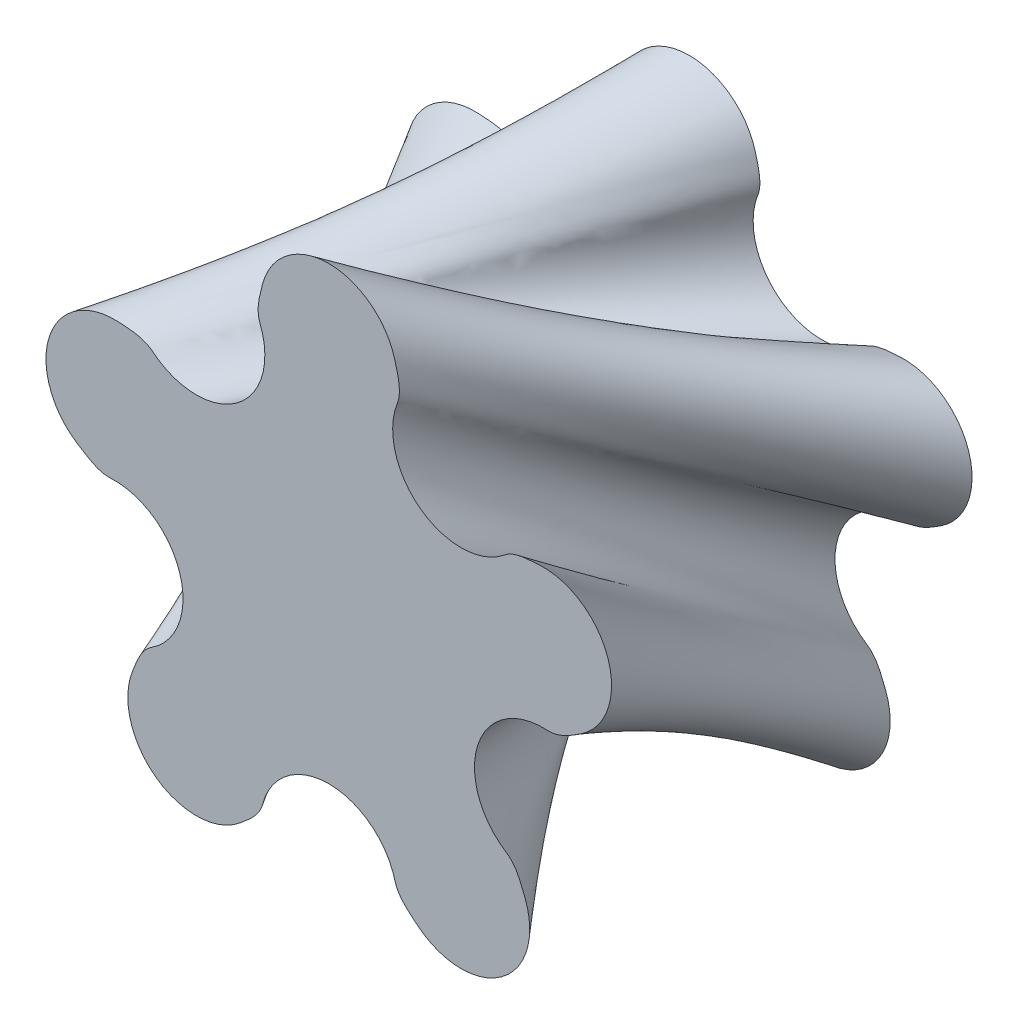
ISO-10303-21;
HEADER;
FILE_DESCRIPTION(('STEP AP214'),'2;1');
FILE_NAME('part.step','',(''),(''),'','','');
FILE_SCHEMA(('AUTOMOTIVE_DESIGN { 1 0 10303 214 1 1 1 1 }'));
ENDSEC;
DATA;
#1=APPLICATION_CONTEXT('core data for automotive mechanical design processes');
#2=APPLICATION_PROTOCOL_DEFINITION('international standard','automotive_design',2000,#1);
#3=PRODUCT_CONTEXT('',#1,'mechanical');
#4=PRODUCT('Part','Part','',(#3));
#5=PRODUCT_RELATED_PRODUCT_CATEGORY('part','',(#4));
#6=PRODUCT_DEFINITION_FORMATION('','',#4);
#7=PRODUCT_DEFINITION_CONTEXT('part definition',#1,'design');
#8=PRODUCT_DEFINITION('design','',#6,#7);
#9=PRODUCT_DEFINITION_SHAPE('','',#8);
#10=(LENGTH_UNIT() NAMED_UNIT(*) SI_UNIT(.MILLI.,.METRE.));
#11=(NAMED_UNIT(*) PLANE_ANGLE_UNIT() SI_UNIT($,.RADIAN.));
#12=(NAMED_UNIT(*) SI_UNIT($,.STERADIAN.) SOLID_ANGLE_UNIT());
#13=UNCERTAINTY_MEASURE_WITH_UNIT(LENGTH_MEASURE(1.E-05),#10,'distance_accuracy_value','');
#14=(GEOMETRIC_REPRESENTATION_CONTEXT(3) GLOBAL_UNCERTAINTY_ASSIGNED_CONTEXT((#13)) GLOBAL_UNIT_ASSIGNED_CONTEXT((#10,
#11,#12)) REPRESENTATION_CONTEXT('',''));
#15=CARTESIAN_POINT('',(0.,0.,0.));
#16=DIRECTION('',(0.,0.,1.));
#17=DIRECTION('',(1.,0.,0.));
#18=AXIS2_PLACEMENT_3D('',#15,#16,#17);
#19=CARTESIAN_POINT('',(-7.83797283048347,0.0889698798174569,12.));
#20=DIRECTION('',(0.,0.,1.));
#21=DIRECTION('',(1.,0.,0.));
#22=AXIS2_PLACEMENT_3D('',#19,#20,#21);
#23=PLANE('',#22);
#24=CARTESIAN_POINT('',(-8.35850427885276,0.393851569912887,12.));
#25=CARTESIAN_POINT('',(-8.02955719358575,0.18428916450994,12.));
#26=CARTESIAN_POINT('',(-7.66147706445491,-0.0646926807636443,12.));
#27=CARTESIAN_POINT('',(-7.27217559089301,-0.0408819826121198,12.));
#28=B_SPLINE_CURVE_WITH_KNOTS('',3,(#24,#25,#26,#27),.UNSPECIFIED.,.F.,.F.,(4,4),(0.,
1.17008686855949),.UNSPECIFIED.);
#29=CARTESIAN_POINT('',(-8.35850427885276,0.393851569912887,12.));
#30=VERTEX_POINT('',#29);
#31=CARTESIAN_POINT('',(-7.27217559085693,-0.0408819826099125,12.));
#32=VERTEX_POINT('',#31);
#33=EDGE_CURVE('E672',#30,#32,#28,.T.);
#34=ORIENTED_EDGE('',*,*,#33,.T.);
#35=CARTESIAN_POINT('',(-7.13292387221381,-2.31762745781239,12.));
#36=DIRECTION('',(0.,0.,-1.));
#37=DIRECTION('',(1.,0.,0.));
#38=AXIS2_PLACEMENT_3D('',#35,#36,#37);
#39=CIRCLE('',#38,2.281);
#40=CARTESIAN_POINT('',(-5.90734346549321,-4.24140334565966,12.));
#41=VERTEX_POINT('',#40);
#42=EDGE_CURVE('E1351',#32,#41,#39,.T.);
#43=ORIENTED_EDGE('',*,*,#42,.T.);
#44=CARTESIAN_POINT('',(-5.90734346557452,-4.24140334571146,12.));
#45=CARTESIAN_POINT('',(-6.23629055084155,-4.45096575111444,12.));
#46=CARTESIAN_POINT('',(-6.3877257738602,-4.86874836679636,12.));
#47=CARTESIAN_POINT('',(-6.53067186476054,-5.23163815965401,12.));
#48=B_SPLINE_CURVE_WITH_KNOTS('',3,(#44,#45,#46,#47),.UNSPECIFIED.,.F.,.F.,(4,4),(0.,
1.17008686855961),.UNSPECIFIED.);
#49=CARTESIAN_POINT('',(-6.53067186476056,-5.23163815965407,12.));
#50=VERTEX_POINT('',#49);
#51=EDGE_CURVE('E1336',#41,#50,#48,.T.);
#52=ORIENTED_EDGE('',*,*,#51,.T.);
#53=CARTESIAN_POINT('',(-4.40838939219349,-6.067627457812,12.));
#54=DIRECTION('',(0.,0.,1.));
#55=DIRECTION('',(1.,0.,0.));
#56=AXIS2_PLACEMENT_3D('',#53,#54,#55);
#57=CIRCLE('',#56,2.281);
#58=CARTESIAN_POINT('',(-2.95749497174001,-7.82770313251948,12.));
#59=VERTEX_POINT('',#58);
#60=EDGE_CURVE('E1326',#50,#59,#57,.T.);
#61=ORIENTED_EDGE('',*,*,#60,.T.);
#62=CARTESIAN_POINT('',(-2.95749497174002,-7.82770313251948,12.));
#63=CARTESIAN_POINT('',(-2.65653904091342,-7.57961420821157,12.));
#64=CARTESIAN_POINT('',(-2.30600021933357,-7.30648882436328,12.));
#65=CARTESIAN_POINT('',(-2.20834476770227,-6.92888321075213,12.));
#66=B_SPLINE_CURVE_WITH_KNOTS('',3,(#62,#63,#64,#65),.UNSPECIFIED.,.F.,.F.,(4,4),(0.,
1.17008686855963),.UNSPECIFIED.);
#67=CARTESIAN_POINT('',(-2.20834476770085,-6.92888321074663,12.));
#68=VERTEX_POINT('',#67);
#69=EDGE_CURVE('E1311',#59,#68,#66,.T.);
#70=ORIENTED_EDGE('',*,*,#69,.T.);
#71=CARTESIAN_POINT('',(2.45248266139697E-13,-7.50000000000012,12.));
#72=DIRECTION('',(0.,0.,-1.));
#73=DIRECTION('',(1.,0.,0.));
#74=AXIS2_PLACEMENT_3D('',#71,#72,#73);
#75=CIRCLE('',#74,2.281);
#76=CARTESIAN_POINT('',(2.20834476770262,-6.92888321075161,12.));
#77=VERTEX_POINT('',#76);
#78=EDGE_CURVE('E1301',#68,#77,#75,.T.);
#79=ORIENTED_EDGE('',*,*,#78,.T.);
#80=CARTESIAN_POINT('',(2.20834476770266,-6.92888321075173,12.));
#81=CARTESIAN_POINT('',(2.30600021933403,-7.30648882436288,12.));
#82=CARTESIAN_POINT('',(2.6565390409134,-7.57961420821156,12.));
#83=CARTESIAN_POINT('',(2.95749497174002,-7.82770313251948,12.));
#84=B_SPLINE_CURVE_WITH_KNOTS('',3,(#80,#81,#82,#83),.UNSPECIFIED.,.F.,.F.,(4,4),(0.,
1.17008686855969),.UNSPECIFIED.);
#85=CARTESIAN_POINT('',(2.95749497174002,-7.82770313251948,12.));
#86=VERTEX_POINT('',#85);
#87=EDGE_CURVE('E1286',#77,#86,#84,.T.);
#88=ORIENTED_EDGE('',*,*,#87,.T.);
#89=CARTESIAN_POINT('',(4.40838939219349,-6.067627457812,12.));
#90=DIRECTION('',(0.,0.,1.));
#91=DIRECTION('',(1.,0.,0.));
#92=AXIS2_PLACEMENT_3D('',#89,#90,#91);
#93=CIRCLE('',#92,2.281);
#94=CARTESIAN_POINT('',(6.53067186476053,-5.231638159654,12.));
#95=VERTEX_POINT('',#94);
#96=EDGE_CURVE('E1276',#86,#95,#93,.T.);
#97=ORIENTED_EDGE('',*,*,#96,.T.);
#98=CARTESIAN_POINT('',(6.53067186476054,-5.23163815965401,12.));
#99=CARTESIAN_POINT('',(6.38772577386021,-4.86874836679637,12.));
#100=CARTESIAN_POINT('',(6.23629055084193,-4.45096575111422,12.));
#101=CARTESIAN_POINT('',(5.90734346557487,-4.24140334571131,12.));
#102=B_SPLINE_CURVE_WITH_KNOTS('',3,(#98,#99,#100,#101),.UNSPECIFIED.,.F.,.F.,(4,4),(0.,
1.17008686855956),.UNSPECIFIED.);
#103=CARTESIAN_POINT('',(5.90734346546938,-4.2414033456441,12.));
#104=VERTEX_POINT('',#103);
#105=EDGE_CURVE('E1261',#95,#104,#102,.T.);
#106=ORIENTED_EDGE('',*,*,#105,.T.);
#107=CARTESIAN_POINT('',(7.13292387221381,-2.31762745781201,12.));
#108=DIRECTION('',(0.,0.,-1.));
#109=DIRECTION('',(1.,0.,0.));
#110=AXIS2_PLACEMENT_3D('',#107,#108,#109);
#111=CIRCLE('',#110,2.281);
#112=CARTESIAN_POINT('',(7.27217559086494,-0.0408819826100231,12.));
#113=VERTEX_POINT('',#112);
#114=EDGE_CURVE('E1251',#104,#113,#111,.T.);
#115=ORIENTED_EDGE('',*,*,#114,.T.);
#116=CARTESIAN_POINT('',(7.27217559089261,-0.0408819826117162,12.));
#117=CARTESIAN_POINT('',(7.66147706445459,-0.0646926807631749,12.));
#118=CARTESIAN_POINT('',(8.02955719358569,0.184289164509899,12.));
#119=CARTESIAN_POINT('',(8.35850427885276,0.393851569912886,12.));
#120=B_SPLINE_CURVE_WITH_KNOTS('',3,(#116,#117,#118,#119),.UNSPECIFIED.,.F.,.F.,(4,4),(0.,
1.17008686855972),.UNSPECIFIED.);
#121=CARTESIAN_POINT('',(8.35850427868479,0.393851569805877,12.));
#122=VERTEX_POINT('',#121);
#123=EDGE_CURVE('E1236',#113,#122,#120,.T.);
#124=ORIENTED_EDGE('',*,*,#123,.T.);
#125=CARTESIAN_POINT('',(7.13292387221353,2.317627457812,12.));
#126=DIRECTION('',(0.,0.,1.));
#127=DIRECTION('',(1.,0.,0.));
#128=AXIS2_PLACEMENT_3D('',#125,#126,#127);
#129=CIRCLE('',#128,2.281);
#130=CARTESIAN_POINT('',(6.99367215345912,4.59437293300767,12.));
#131=VERTEX_POINT('',#130);
#132=EDGE_CURVE('E1226',#122,#131,#129,.T.);
#133=ORIENTED_EDGE('',*,*,#132,.T.);
#134=CARTESIAN_POINT('',(6.99367215353467,4.59437293301229,12.));
#135=CARTESIAN_POINT('',(6.60437067997271,4.57056223486082,12.));
#136=CARTESIAN_POINT('',(6.16023974347369,4.55564070741295,12.));
#137=CARTESIAN_POINT('',(5.85928381264712,4.30755178310499,12.));
#138=B_SPLINE_CURVE_WITH_KNOTS('',3,(#134,#135,#136,#137),.UNSPECIFIED.,.F.,.F.,(4,4),(0.,
1.17008686855966),.UNSPECIFIED.);
#139=CARTESIAN_POINT('',(5.85928381287963,4.30755178329665,12.));
#140=VERTEX_POINT('',#139);
#141=EDGE_CURVE('E1211',#131,#140,#138,.T.);
#142=ORIENTED_EDGE('',*,*,#141,.T.);
#143=CARTESIAN_POINT('',(4.40838939219338,6.06762745781225,12.));
#144=DIRECTION('',(0.,0.,-1.));
#145=DIRECTION('',(1.,0.,0.));
#146=AXIS2_PLACEMENT_3D('',#143,#144,#145);
#147=CIRCLE('',#146,2.281);
#148=CARTESIAN_POINT('',(2.28610691962625,6.90361675597002,12.));
#149=VERTEX_POINT('',#148);
#150=EDGE_CURVE('E1201',#140,#149,#147,.T.);
#151=ORIENTED_EDGE('',*,*,#150,.T.);
#152=CARTESIAN_POINT('',(2.28610691962631,6.90361675597017,12.));
#153=CARTESIAN_POINT('',(2.42905301052667,7.26650654882792,12.));
#154=CARTESIAN_POINT('',(2.30600021933381,7.6935111756371,12.));
#155=CARTESIAN_POINT('',(2.20834476770243,8.07111678924832,12.));
#156=B_SPLINE_CURVE_WITH_KNOTS('',3,(#152,#153,#154,#155),.UNSPECIFIED.,.F.,.F.,(4,4),(0.,
1.1700868685599),.UNSPECIFIED.);
#157=CARTESIAN_POINT('',(2.20834476770243,8.07111678924831,12.));
#158=VERTEX_POINT('',#157);
#159=EDGE_CURVE('E1186',#149,#158,#156,.T.);
#160=ORIENTED_EDGE('',*,*,#159,.T.);
#161=CARTESIAN_POINT('',(0.,7.5,12.));
#162=DIRECTION('',(0.,0.,1.));
#163=DIRECTION('',(1.,0.,0.));
#164=AXIS2_PLACEMENT_3D('',#161,#162,#163);
#165=CIRCLE('',#164,2.281);
#166=CARTESIAN_POINT('',(-2.20834476770243,8.07111678924831,12.));
#167=VERTEX_POINT('',#166);
#168=EDGE_CURVE('E1176',#158,#167,#165,.T.);
#169=ORIENTED_EDGE('',*,*,#168,.T.);
#170=CARTESIAN_POINT('',(-2.20834476770243,8.07111678924832,12.));
#171=CARTESIAN_POINT('',(-2.3060002193338,7.69351117563715,12.));
#172=CARTESIAN_POINT('',(-2.42905301052712,7.26650654882802,12.));
#173=CARTESIAN_POINT('',(-2.28610691962671,6.90361675597034,12.));
#174=B_SPLINE_CURVE_WITH_KNOTS('',3,(#170,#171,#172,#173),.UNSPECIFIED.,.F.,.F.,(4,4),(0.,
1.17008686855976),.UNSPECIFIED.);
#175=CARTESIAN_POINT('',(-2.28610691962324,6.90361675596153,12.));
#176=VERTEX_POINT('',#175);
#177=EDGE_CURVE('E1161',#167,#176,#174,.T.);
#178=ORIENTED_EDGE('',*,*,#177,.T.);
#179=CARTESIAN_POINT('',(-4.40838939219364,6.06762745781203,12.));
#180=DIRECTION('',(0.,0.,-1.));
#181=DIRECTION('',(1.,0.,0.));
#182=AXIS2_PLACEMENT_3D('',#179,#180,#181);
#183=CIRCLE('',#182,2.281);
#184=CARTESIAN_POINT('',(-5.85928381282487,4.30755178325109,12.));
#185=VERTEX_POINT('',#184);
#186=EDGE_CURVE('E1151',#176,#185,#183,.T.);
#187=ORIENTED_EDGE('',*,*,#186,.T.);
#188=CARTESIAN_POINT('',(-5.85928381264705,4.30755178310451,12.));
#189=CARTESIAN_POINT('',(-6.16023974347372,4.55564070741245,12.));
#190=CARTESIAN_POINT('',(-6.60437067997265,4.57056223486082,12.));
#191=CARTESIAN_POINT('',(-6.99367215353467,4.59437293301229,12.));
#192=B_SPLINE_CURVE_WITH_KNOTS('',3,(#188,#189,#190,#191),.UNSPECIFIED.,.F.,.F.,(4,4),(0.,
1.17008686855985),.UNSPECIFIED.);
#193=CARTESIAN_POINT('',(-6.99367215353467,4.59437293301229,12.));
#194=VERTEX_POINT('',#193);
#195=EDGE_CURVE('E531',#185,#194,#192,.T.);
#196=ORIENTED_EDGE('',*,*,#195,.T.);
#197=CARTESIAN_POINT('',(-7.13292387221353,2.317627457812,12.));
#198=DIRECTION('',(0.,0.,1.));
#199=DIRECTION('',(1.,0.,0.));
#200=AXIS2_PLACEMENT_3D('',#197,#198,#199);
#201=CIRCLE('',#200,2.281);
#202=EDGE_CURVE('E12',#194,#30,#201,.T.);
#203=ORIENTED_EDGE('',*,*,#202,.T.);
#204=EDGE_LOOP('',(#34,#43,#52,#61,#70,#79,#88,#97,#106,#115,#124,#133,#142,#151,#160,#169,#178,
#187,#196,#203));
#205=FACE_BOUND('',#204,.T.);
#206=ADVANCED_FACE('F520',(#205),#23,.T.);
#207=CARTESIAN_POINT('',(2.33745142211377,7.4818483398267,0.));
#208=DIRECTION('',(0.,0.,-1.));
#209=DIRECTION('',(-1.,0.,0.));
#210=AXIS2_PLACEMENT_3D('',#207,#208,#209);
#211=PLANE('',#210);
#212=CARTESIAN_POINT('',(2.28610691962631,6.90361675597017,0.));
#213=CARTESIAN_POINT('',(2.42905301052667,7.26650654882792,0.));
#214=CARTESIAN_POINT('',(2.30600021933381,7.6935111756371,0.));
#215=CARTESIAN_POINT('',(2.20834476770243,8.07111678924832,0.));
#216=B_SPLINE_CURVE_WITH_KNOTS('',3,(#212,#213,#214,#215),.UNSPECIFIED.,.F.,.F.,(4,4),(0.,
1.1700868685599),.UNSPECIFIED.);
#217=CARTESIAN_POINT('',(2.28610691965903,6.90361675605324,0.));
#218=VERTEX_POINT('',#217);
#219=CARTESIAN_POINT('',(2.20834476770243,8.07111678924832,0.));
#220=VERTEX_POINT('',#219);
#221=EDGE_CURVE('E664',#218,#220,#216,.T.);
#222=ORIENTED_EDGE('',*,*,#221,.F.);
#223=CARTESIAN_POINT('',(4.40838939219338,6.06762745781225,0.));
#224=DIRECTION('',(0.,0.,-1.));
#225=DIRECTION('',(1.,0.,0.));
#226=AXIS2_PLACEMENT_3D('',#223,#224,#225);
#227=CIRCLE('',#226,2.281);
#228=CARTESIAN_POINT('',(5.85928381264688,4.30755178310479,0.));
#229=VERTEX_POINT('',#228);
#230=EDGE_CURVE('E678',#229,#218,#227,.T.);
#231=ORIENTED_EDGE('',*,*,#230,.F.);
#232=CARTESIAN_POINT('',(6.99367215353467,4.59437293301229,0.));
#233=CARTESIAN_POINT('',(6.60437067997271,4.57056223486082,0.));
#234=CARTESIAN_POINT('',(6.16023974347369,4.55564070741295,0.));
#235=CARTESIAN_POINT('',(5.85928381264712,4.30755178310499,0.));
#236=B_SPLINE_CURVE_WITH_KNOTS('',3,(#232,#233,#234,#235),.UNSPECIFIED.,.F.,.F.,(4,4),(0.,
1.17008686855966),.UNSPECIFIED.);
#237=CARTESIAN_POINT('',(6.99367215353466,4.59437293301229,0.));
#238=VERTEX_POINT('',#237);
#239=EDGE_CURVE('E1106',#238,#229,#236,.T.);
#240=ORIENTED_EDGE('',*,*,#239,.F.);
#241=CARTESIAN_POINT('',(7.13292387221353,2.317627457812,0.));
#242=DIRECTION('',(0.,0.,1.));
#243=DIRECTION('',(1.,0.,0.));
#244=AXIS2_PLACEMENT_3D('',#241,#242,#243);
#245=CIRCLE('',#244,2.281);
#246=CARTESIAN_POINT('',(8.35850427885275,0.393851569912878,0.));
#247=VERTEX_POINT('',#246);
#248=EDGE_CURVE('E1096',#247,#238,#245,.T.);
#249=ORIENTED_EDGE('',*,*,#248,.F.);
#250=CARTESIAN_POINT('',(7.27217559089261,-0.0408819826117162,0.));
#251=CARTESIAN_POINT('',(7.66147706445459,-0.0646926807631749,0.));
#252=CARTESIAN_POINT('',(8.02955719358569,0.184289164509899,0.));
#253=CARTESIAN_POINT('',(8.35850427885276,0.393851569912886,0.));
#254=B_SPLINE_CURVE_WITH_KNOTS('',3,(#250,#251,#252,#253),.UNSPECIFIED.,.F.,.F.,(4,4),(0.,
1.17008686855972),.UNSPECIFIED.);
#255=CARTESIAN_POINT('',(7.27217559081815,-0.0408819826071612,0.));
#256=VERTEX_POINT('',#255);
#257=EDGE_CURVE('E1081',#256,#247,#254,.T.);
#258=ORIENTED_EDGE('',*,*,#257,.F.);
#259=CARTESIAN_POINT('',(7.13292387221381,-2.31762745781201,0.));
#260=DIRECTION('',(0.,0.,-1.));
#261=DIRECTION('',(1.,0.,0.));
#262=AXIS2_PLACEMENT_3D('',#259,#260,#261);
#263=CIRCLE('',#262,2.281);
#264=CARTESIAN_POINT('',(5.90734346557444,-4.24140334571103,0.));
#265=VERTEX_POINT('',#264);
#266=EDGE_CURVE('E1071',#265,#256,#263,.T.);
#267=ORIENTED_EDGE('',*,*,#266,.F.);
#268=CARTESIAN_POINT('',(6.53067186476054,-5.23163815965401,0.));
#269=CARTESIAN_POINT('',(6.38772577386021,-4.86874836679637,0.));
#270=CARTESIAN_POINT('',(6.23629055084193,-4.45096575111422,0.));
#271=CARTESIAN_POINT('',(5.90734346557487,-4.24140334571131,0.));
#272=B_SPLINE_CURVE_WITH_KNOTS('',3,(#268,#269,#270,#271),.UNSPECIFIED.,.F.,.F.,(4,4),(0.,
1.17008686855956),.UNSPECIFIED.);
#273=CARTESIAN_POINT('',(6.53067186465813,-5.23163815939402,0.));
#274=VERTEX_POINT('',#273);
#275=EDGE_CURVE('E1056',#274,#265,#272,.T.);
#276=ORIENTED_EDGE('',*,*,#275,.F.);
#277=CARTESIAN_POINT('',(4.40838939219349,-6.067627457812,0.));
#278=DIRECTION('',(0.,0.,1.));
#279=DIRECTION('',(1.,0.,0.));
#280=AXIS2_PLACEMENT_3D('',#277,#278,#279);
#281=CIRCLE('',#280,2.281);
#282=CARTESIAN_POINT('',(2.95749497173979,-7.82770313251929,0.));
#283=VERTEX_POINT('',#282);
#284=EDGE_CURVE('E1046',#283,#274,#281,.T.);
#285=ORIENTED_EDGE('',*,*,#284,.F.);
#286=CARTESIAN_POINT('',(2.20834476770266,-6.92888321075173,0.));
#287=CARTESIAN_POINT('',(2.30600021933403,-7.30648882436288,0.));
#288=CARTESIAN_POINT('',(2.6565390409134,-7.57961420821156,0.));
#289=CARTESIAN_POINT('',(2.95749497174002,-7.82770313251948,0.));
#290=B_SPLINE_CURVE_WITH_KNOTS('',3,(#286,#287,#288,#289),.UNSPECIFIED.,.F.,.F.,(4,4),(0.,
1.17008686855969),.UNSPECIFIED.);
#291=CARTESIAN_POINT('',(2.20834476770238,-6.92888321075068,0.));
#292=VERTEX_POINT('',#291);
#293=EDGE_CURVE('E1031',#292,#283,#290,.T.);
#294=ORIENTED_EDGE('',*,*,#293,.F.);
#295=CARTESIAN_POINT('',(2.45248266139697E-13,-7.50000000000012,0.));
#296=DIRECTION('',(0.,0.,-1.));
#297=DIRECTION('',(1.,0.,0.));
#298=AXIS2_PLACEMENT_3D('',#295,#296,#297);
#299=CIRCLE('',#298,2.281);
#300=CARTESIAN_POINT('',(-2.20834476762542,-6.92888321045496,0.));
#301=VERTEX_POINT('',#300);
#302=EDGE_CURVE('E1021',#301,#292,#299,.T.);
#303=ORIENTED_EDGE('',*,*,#302,.F.);
#304=CARTESIAN_POINT('',(-2.95749497174002,-7.82770313251948,0.));
#305=CARTESIAN_POINT('',(-2.65653904091342,-7.57961420821157,0.));
#306=CARTESIAN_POINT('',(-2.30600021933357,-7.30648882436328,0.));
#307=CARTESIAN_POINT('',(-2.20834476770227,-6.92888321075213,0.));
#308=B_SPLINE_CURVE_WITH_KNOTS('',3,(#304,#305,#306,#307),.UNSPECIFIED.,.F.,.F.,(4,4),(0.,
1.17008686855963),.UNSPECIFIED.);
#309=CARTESIAN_POINT('',(-2.95749497164775,-7.82770313244342,0.));
#310=VERTEX_POINT('',#309);
#311=EDGE_CURVE('E1006',#310,#301,#308,.T.);
#312=ORIENTED_EDGE('',*,*,#311,.F.);
#313=CARTESIAN_POINT('',(-4.40838939219349,-6.067627457812,0.));
#314=DIRECTION('',(0.,0.,1.));
#315=DIRECTION('',(1.,0.,0.));
#316=AXIS2_PLACEMENT_3D('',#313,#314,#315);
#317=CIRCLE('',#316,2.281);
#318=CARTESIAN_POINT('',(-6.53067186476054,-5.23163815965401,0.));
#319=VERTEX_POINT('',#318);
#320=EDGE_CURVE('E996',#319,#310,#317,.T.);
#321=ORIENTED_EDGE('',*,*,#320,.F.);
#322=CARTESIAN_POINT('',(-5.90734346557452,-4.24140334571146,0.));
#323=CARTESIAN_POINT('',(-6.23629055084155,-4.45096575111444,0.));
#324=CARTESIAN_POINT('',(-6.3877257738602,-4.86874836679636,0.));
#325=CARTESIAN_POINT('',(-6.53067186476054,-5.23163815965401,0.));
#326=B_SPLINE_CURVE_WITH_KNOTS('',3,(#322,#323,#324,#325),.UNSPECIFIED.,.F.,.F.,(4,4),(0.,
1.17008686855961),.UNSPECIFIED.);
#327=CARTESIAN_POINT('',(-5.90734346557118,-4.24140334570934,0.));
#328=VERTEX_POINT('',#327);
#329=EDGE_CURVE('E981',#328,#319,#326,.T.);
#330=ORIENTED_EDGE('',*,*,#329,.F.);
#331=CARTESIAN_POINT('',(-7.13292387221381,-2.31762745781239,0.));
#332=DIRECTION('',(0.,0.,-1.));
#333=DIRECTION('',(1.,0.,0.));
#334=AXIS2_PLACEMENT_3D('',#331,#332,#333);
#335=CIRCLE('',#334,2.281);
#336=CARTESIAN_POINT('',(-7.27217559089251,-0.0408819826120885,0.));
#337=VERTEX_POINT('',#336);
#338=EDGE_CURVE('E971',#337,#328,#335,.T.);
#339=ORIENTED_EDGE('',*,*,#338,.F.);
#340=CARTESIAN_POINT('',(-8.35850427885276,0.393851569912887,0.));
#341=CARTESIAN_POINT('',(-8.02955719358575,0.18428916450994,0.));
#342=CARTESIAN_POINT('',(-7.66147706445491,-0.0646926807636443,0.));
#343=CARTESIAN_POINT('',(-7.27217559089301,-0.0408819826121198,0.));
#344=B_SPLINE_CURVE_WITH_KNOTS('',3,(#340,#341,#342,#343),.UNSPECIFIED.,.F.,.F.,(4,4),(0.,
1.17008686855949),.UNSPECIFIED.);
#345=CARTESIAN_POINT('',(-8.35850427885275,0.393851569912881,0.));
#346=VERTEX_POINT('',#345);
#347=EDGE_CURVE('E956',#346,#337,#344,.T.);
#348=ORIENTED_EDGE('',*,*,#347,.F.);
#349=CARTESIAN_POINT('',(-7.13292387221353,2.317627457812,0.));
#350=DIRECTION('',(0.,0.,1.));
#351=DIRECTION('',(1.,0.,0.));
#352=AXIS2_PLACEMENT_3D('',#349,#350,#351);
#353=CIRCLE('',#352,2.281);
#354=CARTESIAN_POINT('',(-6.99367215353466,4.59437293301229,0.));
#355=VERTEX_POINT('',#354);
#356=EDGE_CURVE('E946',#355,#346,#353,.T.);
#357=ORIENTED_EDGE('',*,*,#356,.F.);
#358=CARTESIAN_POINT('',(-5.85928381264705,4.30755178310451,0.));
#359=CARTESIAN_POINT('',(-6.16023974347372,4.55564070741245,0.));
#360=CARTESIAN_POINT('',(-6.60437067997265,4.57056223486082,0.));
#361=CARTESIAN_POINT('',(-6.99367215353467,4.59437293301229,0.));
#362=B_SPLINE_CURVE_WITH_KNOTS('',3,(#358,#359,#360,#361),.UNSPECIFIED.,.F.,.F.,(4,4),(0.,
1.17008686855985),.UNSPECIFIED.);
#363=CARTESIAN_POINT('',(-5.85928381264752,4.30755178310489,0.));
#364=VERTEX_POINT('',#363);
#365=EDGE_CURVE('E931',#364,#355,#362,.T.);
#366=ORIENTED_EDGE('',*,*,#365,.F.);
#367=CARTESIAN_POINT('',(-4.40838939219364,6.06762745781203,0.));
#368=DIRECTION('',(0.,0.,-1.));
#369=DIRECTION('',(1.,0.,0.));
#370=AXIS2_PLACEMENT_3D('',#367,#368,#369);
#371=CIRCLE('',#370,2.281);
#372=CARTESIAN_POINT('',(-2.28610691962419,6.90361675596395,0.));
#373=VERTEX_POINT('',#372);
#374=EDGE_CURVE('E924',#373,#364,#371,.T.);
#375=ORIENTED_EDGE('',*,*,#374,.F.);
#376=CARTESIAN_POINT('',(-2.20834476770243,8.07111678924832,0.));
#377=CARTESIAN_POINT('',(-2.3060002193338,7.69351117563715,0.));
#378=CARTESIAN_POINT('',(-2.42905301052712,7.26650654882802,0.));
#379=CARTESIAN_POINT('',(-2.28610691962671,6.90361675597034,0.));
#380=B_SPLINE_CURVE_WITH_KNOTS('',3,(#376,#377,#378,#379),.UNSPECIFIED.,.F.,.F.,(4,4),(0.,
1.17008686855976),.UNSPECIFIED.);
#381=CARTESIAN_POINT('',(-2.20834476770243,8.07111678924832,0.));
#382=VERTEX_POINT('',#381);
#383=EDGE_CURVE('E667',#382,#373,#380,.T.);
#384=ORIENTED_EDGE('',*,*,#383,.F.);
#385=CARTESIAN_POINT('',(0.,7.5,0.));
#386=DIRECTION('',(0.,0.,1.));
#387=DIRECTION('',(1.,0.,0.));
#388=AXIS2_PLACEMENT_3D('',#385,#386,#387);
#389=CIRCLE('',#388,2.281);
#390=EDGE_CURVE('E659',#220,#382,#389,.T.);
#391=ORIENTED_EDGE('',*,*,#390,.F.);
#392=EDGE_LOOP('',(#222,#231,#240,#249,#258,#267,#276,#285,#294,#303,#312,#321,#330,#339,#348,
#357,#366,#375,#384,#391));
#393=FACE_BOUND('',#392,.T.);
#394=ADVANCED_FACE('F662',(#393),#211,.T.);
#395=CARTESIAN_POINT('',(2.20834475978473,8.07111681986379,0.));
#396=CARTESIAN_POINT('',(-6.99367218509841,4.59437293494281,12.));
#397=CARTESIAN_POINT('',(2.08291575813124,8.55611478303731,0.));
#398=CARTESIAN_POINT('',(-7.49369235146287,4.62495547844571,12.));
#399=CARTESIAN_POINT('',(1.50215573231463,9.43912056971102,0.));
#400=CARTESIAN_POINT('',(-8.51294547643621,4.34548366570268,12.));
#401=CARTESIAN_POINT('',(0.,9.95301122470462,0.));
#402=CARTESIAN_POINT('',(-9.46587618201401,3.07564961363822,12.));
#403=CARTESIAN_POINT('',(-1.50215573231462,9.43912056971104,0.));
#404=CARTESIAN_POINT('',(-9.44132877540213,1.48821367028678,12.));
#405=CARTESIAN_POINT('',(-2.08291575813123,8.55611478303731,0.));
#406=CARTESIAN_POINT('',(-8.78100508569072,0.663014269116564,12.));
#407=CARTESIAN_POINT('',(-2.233182758817,7.97507540375464,0.));
#408=CARTESIAN_POINT('',(-8.27483885470552,0.340550816330828,12.));
#409=CARTESIAN_POINT('',(-2.28424445022321,7.78335831604808,0.));
#410=CARTESIAN_POINT('',(-8.10828399956317,0.232744423772507,12.));
#411=CARTESIAN_POINT('',(-2.3431300368958,7.49137923879324,0.));
#412=CARTESIAN_POINT('',(-7.84879204252377,0.0865144059780041,12.));
#413=CARTESIAN_POINT('',(-2.36123732089393,7.19300240549195,0.));
#414=CARTESIAN_POINT('',(-7.57061426937859,-0.0229101566787416,12.));
#415=CARTESIAN_POINT('',(-2.32246427271182,6.99591527387176,0.));
#416=CARTESIAN_POINT('',(-7.37119173776133,-0.0469380695917998,12.));
#417=CARTESIAN_POINT('',(-2.10250645181674,6.4375198147217,0.));
#418=CARTESIAN_POINT('',(-6.7721553929648,-0.0102994371786217,12.));
#419=CARTESIAN_POINT('',(-2.05333340326015,5.3817909488752,0.));
#420=CARTESIAN_POINT('',(-5.75290226799139,-0.289771249921512,12.));
#421=CARTESIAN_POINT('',(-2.96654557060417,4.08309968963361,0.));
#422=CARTESIAN_POINT('',(-4.79997156241336,-1.55960530198593,12.));
#423=CARTESIAN_POINT('',(-4.48387243454064,3.61590097667263,0.));
#424=CARTESIAN_POINT('',(-4.82451896902515,-3.14704124533748,12.));
#425=CARTESIAN_POINT('',(-5.4727349441757,3.98890548592705,0.));
#426=CARTESIAN_POINT('',(-5.48484265873654,-3.97224064650776,12.));
#427=CARTESIAN_POINT('',(-5.93582988020639,4.37065149178491,0.));
#428=CARTESIAN_POINT('',(-5.99100889041975,-4.29470409973819,12.));
#429=CARTESIAN_POINT('',(-6.11127854905436,4.46844014489541,0.));
#430=CARTESIAN_POINT('',(-6.13822804649468,-4.43134734385317,12.));
#431=CARTESIAN_POINT('',(-6.40067164193599,4.54338948388196,0.));
#432=CARTESIAN_POINT('',(-6.29893648748496,-4.68341591114496,12.));
#433=CARTESIAN_POINT('',(-6.69653867876263,4.57764782501811,0.));
#434=CARTESIAN_POINT('',(-6.4229460485147,-4.95421577486564,12.));
#435=CARTESIAN_POINT('',(-6.89465600584029,4.5883168459821,0.));
#436=CARTESIAN_POINT('',(-6.49431451137212,-5.13933964098258,12.));
#437=CARTESIAN_POINT('',(-7.49369235146288,4.62495547844571,0.));
#438=CARTESIAN_POINT('',(-6.71427233257042,-5.69773510090265,12.));
#439=CARTESIAN_POINT('',(-8.5129454764362,4.34548366570267,0.));
#440=CARTESIAN_POINT('',(-6.76344538112688,-6.75346396674908,12.));
#441=CARTESIAN_POINT('',(-9.46587618201405,3.07564961363822,0.));
#442=CARTESIAN_POINT('',(-5.8502332137828,-8.05215522599054,12.));
#443=CARTESIAN_POINT('',(-9.44132877540211,1.48821367028677,0.));
#444=CARTESIAN_POINT('',(-4.33290634984633,-8.51935393895138,12.));
#445=CARTESIAN_POINT('',(-8.78100508569073,0.663014269116566,0.));
#446=CARTESIAN_POINT('',(-3.34404384021134,-8.14634942969693,12.));
#447=CARTESIAN_POINT('',(-8.27483885470552,0.34055081633083,0.));
#448=CARTESIAN_POINT('',(-2.88094890481928,-7.7646034243655,12.));
#449=CARTESIAN_POINT('',(-8.10828399956317,0.23274442377251,0.));
#450=CARTESIAN_POINT('',(-2.72695065194375,-7.63951435146454,12.));
#451=CARTESIAN_POINT('',(-7.84879204252378,0.0865144059780048,0.));
#452=CARTESIAN_POINT('',(-2.5076902160135,-7.43791039538227,12.));
#453=CARTESIAN_POINT('',(-7.57061426937858,-0.0229101566787439,0.));
#454=CARTESIAN_POINT('',(-2.31765961329678,-7.207161661007,12.));
#455=CARTESIAN_POINT('',(-7.37119173776132,-0.0469380695917995,0.));
#456=CARTESIAN_POINT('',(-2.23318275881683,-7.02492459624581,12.));
#457=CARTESIAN_POINT('',(-6.7721553929648,-0.0102994371786214,0.));
#458=CARTESIAN_POINT('',(-2.08291575813114,-6.4438852169631,12.));
#459=CARTESIAN_POINT('',(-5.75290226799139,-0.28977124992152,0.));
#460=CARTESIAN_POINT('',(-1.50215573231462,-5.56087943028927,12.));
#461=CARTESIAN_POINT('',(-4.79997156241336,-1.55960530198593,0.));
#462=CARTESIAN_POINT('',(0.,-5.04698877529547,12.));
#463=CARTESIAN_POINT('',(-4.82451896902515,-3.14704124533747,0.));
#464=CARTESIAN_POINT('',(1.50215573231476,-5.560879430289,12.));
#465=CARTESIAN_POINT('',(-5.48484265873654,-3.97224064650776,0.));
#466=CARTESIAN_POINT('',(2.08291575813144,-6.44388521696272,12.));
#467=CARTESIAN_POINT('',(-5.99100889041974,-4.29470409973819,0.));
#468=CARTESIAN_POINT('',(2.23318275902445,-7.02492459704664,12.));
#469=CARTESIAN_POINT('',(-6.13822804649467,-4.43134734385316,0.));
#470=CARTESIAN_POINT('',(2.317644985623,-7.20716341935323,12.));
#471=CARTESIAN_POINT('',(-6.29893648748496,-4.68341591114496,0.));
#472=CARTESIAN_POINT('',(2.50771479969355,-7.43789970042163,12.));
#473=CARTESIAN_POINT('',(-6.42294604851471,-4.95421577486564,0.));
#474=CARTESIAN_POINT('',(2.72693971287376,-7.63952156148602,12.));
#475=CARTESIAN_POINT('',(-6.49431451137213,-5.13933964098259,0.));
#476=CARTESIAN_POINT('',(2.88094890418068,-7.76460342383908,12.));
#477=CARTESIAN_POINT('',(-6.71427233257042,-5.69773510090265,0.));
#478=CARTESIAN_POINT('',(3.34404384021134,-8.14634942969693,12.));
#479=CARTESIAN_POINT('',(-6.76344538112689,-6.7534639667491,0.));
#480=CARTESIAN_POINT('',(4.33290634984632,-8.5193539389514,12.));
#481=CARTESIAN_POINT('',(-5.85023321378277,-8.05215522599053,0.));
#482=CARTESIAN_POINT('',(5.85023321378278,-8.05215522599052,12.));
#483=CARTESIAN_POINT('',(-4.33290634984633,-8.51935393895139,0.));
#484=CARTESIAN_POINT('',(6.76344538112689,-6.75346396674911,12.));
#485=CARTESIAN_POINT('',(-3.34404384021134,-8.14634942969693,0.));
#486=CARTESIAN_POINT('',(6.71427233257042,-5.69773510090265,12.));
#487=CARTESIAN_POINT('',(-2.88094890481927,-7.7646034243655,0.));
#488=CARTESIAN_POINT('',(6.49431451167544,-5.1393396417526,12.));
#489=CARTESIAN_POINT('',(-2.72695065194375,-7.63951435146453,0.));
#490=CARTESIAN_POINT('',(6.42293581101824,-4.95422395052027,12.));
#491=CARTESIAN_POINT('',(-2.50769021601351,-7.43791039538229,0.));
#492=CARTESIAN_POINT('',(6.29895425577181,-4.68339583560049,12.));
#493=CARTESIAN_POINT('',(-2.31765961329678,-7.20716166100699,0.));
#494=CARTESIAN_POINT('',(6.1382218540081,-4.43136071223883,12.));
#495=CARTESIAN_POINT('',(-2.23318275881683,-7.02492459624581,0.));
#496=CARTESIAN_POINT('',(5.99100888972212,-4.29470409929335,12.));
#497=CARTESIAN_POINT('',(-2.08291575813114,-6.4438852169631,0.));
#498=CARTESIAN_POINT('',(5.48484265873684,-3.97224064650768,12.));
#499=CARTESIAN_POINT('',(-1.50215573231462,-5.56087943028927,0.));
#500=CARTESIAN_POINT('',(4.8245189690253,-3.14704124533751,12.));
#501=CARTESIAN_POINT('',(0.,-5.04698877529547,0.));
#502=CARTESIAN_POINT('',(4.79997156241323,-1.55960530198599,12.));
#503=CARTESIAN_POINT('',(1.50215573231477,-5.56087943028901,0.));
#504=CARTESIAN_POINT('',(5.75290226799101,-0.289771249921393,12.));
#505=CARTESIAN_POINT('',(2.08291575813144,-6.44388521696273,0.));
#506=CARTESIAN_POINT('',(6.77215539296438,-0.0102994371783081,12.));
#507=CARTESIAN_POINT('',(2.23318275902445,-7.02492459704665,0.));
#508=CARTESIAN_POINT('',(7.37119173858697,-0.0469380696419017,12.));
#509=CARTESIAN_POINT('',(2.317644985623,-7.20716341935323,0.));
#510=CARTESIAN_POINT('',(7.57061142146532,-0.0229246117821626,12.));
#511=CARTESIAN_POINT('',(2.50771479969355,-7.43789970042164,0.));
#512=CARTESIAN_POINT('',(7.84878946778663,0.0865410913716339,12.));
#513=CARTESIAN_POINT('',(2.72693971287376,-7.63952156148601,0.));
#514=CARTESIAN_POINT('',(8.10828747634254,0.23273179207953,12.));
#515=CARTESIAN_POINT('',(2.88094890418068,-7.76460342383908,0.));
#516=CARTESIAN_POINT('',(8.27483885400753,0.34055081588616,12.));
#517=CARTESIAN_POINT('',(3.34404384021133,-8.14634942969692,0.));
#518=CARTESIAN_POINT('',(8.78100508569073,0.663014269116569,12.));
#519=CARTESIAN_POINT('',(4.33290634984632,-8.51935393895141,0.));
#520=CARTESIAN_POINT('',(9.44132877540212,1.48821367028678,12.));
#521=CARTESIAN_POINT('',(5.85023321378278,-8.05215522599052,0.));
#522=CARTESIAN_POINT('',(9.46587618201402,3.07564961363823,12.));
#523=CARTESIAN_POINT('',(6.76344538112688,-6.7534639667491,0.));
#524=CARTESIAN_POINT('',(8.51294547643622,4.34548366570267,12.));
#525=CARTESIAN_POINT('',(6.71427233257042,-5.69773510090265,0.));
#526=CARTESIAN_POINT('',(7.49369235146288,4.62495547844571,12.));
#527=CARTESIAN_POINT('',(6.49431451167544,-5.13933964175259,0.));
#528=CARTESIAN_POINT('',(6.89465600666635,4.58831684603262,12.));
#529=CARTESIAN_POINT('',(6.42293581101823,-4.95422395052025,0.));
#530=CARTESIAN_POINT('',(6.69654329071187,4.57763556216417,12.));
#531=CARTESIAN_POINT('',(6.29895425577181,-4.6833958356005,0.));
#532=CARTESIAN_POINT('',(6.40065803966127,4.54341258621141,12.));
#533=CARTESIAN_POINT('',(6.1382218540081,-4.43136071223882,0.));
#534=CARTESIAN_POINT('',(6.11128934956117,4.46843012443242,12.));
#535=CARTESIAN_POINT('',(5.99100888972212,-4.29470409929335,0.));
#536=CARTESIAN_POINT('',(5.93582987956785,4.37065149125898,12.));
#537=CARTESIAN_POINT('',(5.48484265873684,-3.97224064650768,0.));
#538=CARTESIAN_POINT('',(5.47273494417583,3.98890548592747,12.));
#539=CARTESIAN_POINT('',(4.8245189690253,-3.14704124533751,0.));
#540=CARTESIAN_POINT('',(4.48387243454084,3.61590097667286,12.));
#541=CARTESIAN_POINT('',(4.79997156241323,-1.55960530198598,0.));
#542=CARTESIAN_POINT('',(2.96654557060429,4.08309968963356,12.));
#543=CARTESIAN_POINT('',(5.75290226799102,-0.28977124992139,0.));
#544=CARTESIAN_POINT('',(2.05333340326002,5.38179094887499,12.));
#545=CARTESIAN_POINT('',(6.77215539296438,-0.0102994371783086,0.));
#546=CARTESIAN_POINT('',(2.10250645181642,6.4375198147215,12.));
#547=CARTESIAN_POINT('',(7.37119173858698,-0.0469380696419023,0.));
#548=CARTESIAN_POINT('',(2.32246427301472,6.99591527464162,12.));
#549=CARTESIAN_POINT('',(7.57061142146533,-0.0229246117821605,0.));
#550=CARTESIAN_POINT('',(2.36125018846072,7.19299523009297,12.));
#551=CARTESIAN_POINT('',(7.84878946778662,0.0865410913716343,0.));
#552=CARTESIAN_POINT('',(2.3431038619408,7.49138503631288,12.));
#553=CARTESIAN_POINT('',(8.10828747634253,0.232731792079523,0.));
#554=CARTESIAN_POINT('',(2.28425753806105,7.78335771925397,12.));
#555=CARTESIAN_POINT('',(8.27483885400752,0.340550815886156,0.));
#556=CARTESIAN_POINT('',(2.23318275902422,7.9750754029534,12.));
#557=CARTESIAN_POINT('',(8.78100508569073,0.663014269116565,0.));
#558=CARTESIAN_POINT('',(2.08291575813123,8.55611478303731,12.));
#559=CARTESIAN_POINT('',(9.44132877540212,1.48821367028677,0.));
#560=CARTESIAN_POINT('',(1.50215573231462,9.43912056971102,12.));
#561=CARTESIAN_POINT('',(9.46587618201404,3.07564961363823,0.));
#562=CARTESIAN_POINT('',(0.,9.95301122470463,12.));
#563=CARTESIAN_POINT('',(8.5129454764362,4.34548366570268,0.));
#564=CARTESIAN_POINT('',(-1.50215573231463,9.43912056971102,12.));
#565=CARTESIAN_POINT('',(7.49369235146287,4.62495547844571,0.));
#566=CARTESIAN_POINT('',(-2.08291575813123,8.55611478303731,12.));
#567=CARTESIAN_POINT('',(6.89465600666635,4.58831684603262,0.));
#568=CARTESIAN_POINT('',(-2.233182758817,7.97507540375464,12.));
#569=CARTESIAN_POINT('',(6.69654329071186,4.57763556216417,0.));
#570=CARTESIAN_POINT('',(-2.28424445022321,7.78335831604808,12.));
#571=CARTESIAN_POINT('',(6.40065803966127,4.54341258621141,0.));
#572=CARTESIAN_POINT('',(-2.3431300368958,7.49137923879324,12.));
#573=CARTESIAN_POINT('',(6.11128934956118,4.46843012443243,0.));
#574=CARTESIAN_POINT('',(-2.36123732089393,7.19300240549195,12.));
#575=CARTESIAN_POINT('',(5.93582987956786,4.37065149125899,0.));
#576=CARTESIAN_POINT('',(-2.32246427271182,6.99591527387176,12.));
#577=CARTESIAN_POINT('',(5.47273494417583,3.98890548592747,0.));
#578=CARTESIAN_POINT('',(-2.10250645181674,6.4375198147217,12.));
#579=CARTESIAN_POINT('',(4.48387243454085,3.61590097667286,0.));
#580=CARTESIAN_POINT('',(-2.05333340326014,5.38179094887521,12.));
#581=CARTESIAN_POINT('',(2.96654557060428,4.08309968963355,0.));
#582=CARTESIAN_POINT('',(-2.96654557060417,4.0830996896336,12.));
#583=CARTESIAN_POINT('',(2.05333340326002,5.381790948875,0.));
#584=CARTESIAN_POINT('',(-4.48387243454067,3.61590097667263,12.));
#585=CARTESIAN_POINT('',(2.10250645181643,6.4375198147215,0.));
#586=CARTESIAN_POINT('',(-5.47273494417571,3.98890548592706,12.));
#587=CARTESIAN_POINT('',(2.32246427301472,6.99591527464162,0.));
#588=CARTESIAN_POINT('',(-5.93582988020641,4.37065149178491,12.));
#589=CARTESIAN_POINT('',(2.36125018846072,7.19299523009298,0.));
#590=CARTESIAN_POINT('',(-6.11127854905437,4.46844014489541,12.));
#591=CARTESIAN_POINT('',(2.3431038619408,7.49138503631288,0.));
#592=CARTESIAN_POINT('',(-6.400671641936,4.54338948388196,12.));
#593=CARTESIAN_POINT('',(2.28425753806105,7.78335771925397,0.));
#594=CARTESIAN_POINT('',(-6.69653867876261,4.57764782501811,12.));
#595=CARTESIAN_POINT('',(2.23318275902422,7.97507540295339,0.));
#596=CARTESIAN_POINT('',(-6.89465600584028,4.5883168459821,12.));
#597=CARTESIAN_POINT('',(2.20834475978473,8.07111681986379,0.));
#598=CARTESIAN_POINT('',(-6.99367218509841,4.59437293494281,12.));
#599=B_SPLINE_SURFACE_WITH_KNOTS('',3,1,((#395,#396),(#397,#398),(#399,#400),(#401,#402),(#403,
#404),(#405,#406),(#407,#408),(#409,#410),(#411,#412),(#413,#414),(#415,#416),(#417,#418),(#419,
#420),(#421,#422),(#423,#424),(#425,#426),(#427,#428),(#429,#430),(#431,#432),(#433,#434),(#435,
#436),(#437,#438),(#439,#440),(#441,#442),(#443,#444),(#445,#446),(#447,#448),(#449,#450),(#451,
#452),(#453,#454),(#455,#456),(#457,#458),(#459,#460),(#461,#462),(#463,#464),(#465,#466),(#467,
#468),(#469,#470),(#471,#472),(#473,#474),(#475,#476),(#477,#478),(#479,#480),(#481,#482),(#483,
#484),(#485,#486),(#487,#488),(#489,#490),(#491,#492),(#493,#494),(#495,#496),(#497,#498),(#499,
#500),(#501,#502),(#503,#504),(#505,#506),(#507,#508),(#509,#510),(#511,#512),(#513,#514),(#515,
#516),(#517,#518),(#519,#520),(#521,#522),(#523,#524),(#525,#526),(#527,#528),(#529,#530),(#531,
#532),(#533,#534),(#535,#536),(#537,#538),(#539,#540),(#541,#542),(#543,#544),(#545,#546),(#547,
#548),(#549,#550),(#551,#552),(#553,#554),(#555,#556),(#557,#558),(#559,#560),(#561,#562),(#563,
#564),(#565,#566),(#567,#568),(#569,#570),(#571,#572),(#573,#574),(#575,#576),(#577,#578),(#579,
#580),(#581,#582),(#583,#584),(#585,#586),(#587,#588),(#589,#590),(#591,#592),(#593,#594),(#595,
#596),(#597,#598)),.UNSPECIFIED.,.T.,.F.,.F.,(4,1,1,1,2,1,1,1,2,1,1,1,2,1,1,1,2,1,1,1,2,1,1,1,2,
1,1,1,2,1,1,1,2,1,1,1,2,1,1,1,2,1,1,1,2,1,1,1,2,1,1,1,2,1,1,1,2,1,1,1,2,1,1,1,2,1,1,1,2,1,1,1,2,
1,1,1,2,1,1,1,4),(2,2),(0.,0.0208676892331022,0.0417353784662044,0.0626030676993065,
0.0834707569324087,0.0876030674179697,0.0917353779035307,0.0958676883890917,0.0999999988746527,
0.120867688107756,0.141735377340859,0.162603066573962,0.183470755807065,0.187603066855299,
0.191735377903533,0.195867688951766,0.2,0.220867689233102,0.241735378466204,0.262603067699306,
0.283470756932408,0.287603067417969,0.29173537790353,0.295867688389091,0.299999998874652,
0.320867688107755,0.341735377340858,0.362603066573961,0.383470755807064,0.387603066855297,
0.391735377903531,0.395867688951764,0.399999999999997,0.4208676892331,0.441735378466202,
0.462603067699304,0.483470756932406,0.487603067417967,0.491735377903528,0.495867688389089,
0.49999999887465,0.520867688107753,0.541735377340856,0.562603066573959,0.583470755807062,
0.587603066855296,0.591735377903529,0.595867688951763,0.599999999999996,0.620867689233099,
0.641735378466201,0.662603067699303,0.683470756932405,0.687603067417966,0.691735377903527,
0.695867688389088,0.699999998874649,0.720867688107752,0.741735377340855,0.762603066573958,
0.783470755807061,0.787603066855295,0.791735377903529,0.795867688951763,0.799999999999997,
0.820867689233099,0.841735378466201,0.862603067699304,0.883470756932406,0.887603067417967,
0.891735377903528,0.895867688389089,0.899999998874651,0.920867688107754,0.941735377340857,
0.96260306657396,0.983470755807063,0.987603066855298,0.991735377903532,0.995867688951766,1.),
(0.,1.),.UNSPECIFIED.);
#600=ORIENTED_EDGE('',*,*,#390,.T.);
#601=ORIENTED_EDGE('',*,*,#383,.T.);
#602=ORIENTED_EDGE('',*,*,#374,.T.);
#603=ORIENTED_EDGE('',*,*,#365,.T.);
#604=ORIENTED_EDGE('',*,*,#356,.T.);
#605=ORIENTED_EDGE('',*,*,#347,.T.);
#606=ORIENTED_EDGE('',*,*,#338,.T.);
#607=ORIENTED_EDGE('',*,*,#329,.T.);
#608=ORIENTED_EDGE('',*,*,#320,.T.);
#609=ORIENTED_EDGE('',*,*,#311,.T.);
#610=ORIENTED_EDGE('',*,*,#302,.T.);
#611=ORIENTED_EDGE('',*,*,#293,.T.);
#612=ORIENTED_EDGE('',*,*,#284,.T.);
#613=ORIENTED_EDGE('',*,*,#275,.T.);
#614=ORIENTED_EDGE('',*,*,#266,.T.);
#615=ORIENTED_EDGE('',*,*,#257,.T.);
#616=ORIENTED_EDGE('',*,*,#248,.T.);
#617=ORIENTED_EDGE('',*,*,#239,.T.);
#618=ORIENTED_EDGE('',*,*,#230,.T.);
#619=ORIENTED_EDGE('',*,*,#221,.T.);
#620=EDGE_LOOP('',(#600,#601,#602,#603,#604,#605,#606,#607,#608,#609,#610,#611,#612,#613,#614,
#615,#616,#617,#618,#619));
#621=FACE_BOUND('',#620,.T.);
#622=ORIENTED_EDGE('',*,*,#195,.F.);
#623=ORIENTED_EDGE('',*,*,#186,.F.);
#624=ORIENTED_EDGE('',*,*,#177,.F.);
#625=ORIENTED_EDGE('',*,*,#168,.F.);
#626=ORIENTED_EDGE('',*,*,#159,.F.);
#627=ORIENTED_EDGE('',*,*,#150,.F.);
#628=ORIENTED_EDGE('',*,*,#141,.F.);
#629=ORIENTED_EDGE('',*,*,#132,.F.);
#630=ORIENTED_EDGE('',*,*,#123,.F.);
#631=ORIENTED_EDGE('',*,*,#114,.F.);
#632=ORIENTED_EDGE('',*,*,#105,.F.);
#633=ORIENTED_EDGE('',*,*,#96,.F.);
#634=ORIENTED_EDGE('',*,*,#87,.F.);
#635=ORIENTED_EDGE('',*,*,#78,.F.);
#636=ORIENTED_EDGE('',*,*,#69,.F.);
#637=ORIENTED_EDGE('',*,*,#60,.F.);
#638=ORIENTED_EDGE('',*,*,#51,.F.);
#639=ORIENTED_EDGE('',*,*,#42,.F.);
#640=ORIENTED_EDGE('',*,*,#33,.F.);
#641=ORIENTED_EDGE('',*,*,#202,.F.);
#642=EDGE_LOOP('',(#622,#623,#624,#625,#626,#627,#628,#629,#630,#631,#632,#633,#634,#635,#636,
#637,#638,#639,#640,#641));
#643=FACE_BOUND('',#642,.T.);
#644=ADVANCED_FACE('F677',(#621,#643),#599,.T.);
#645=CLOSED_SHELL('',(#206,#394,#644));
#646=MANIFOLD_SOLID_BREP('B2',#645);
#647=ADVANCED_BREP_SHAPE_REPRESENTATION('',(#18,#646),#14);
#648=SHAPE_DEFINITION_REPRESENTATION(#9,#647);
ENDSEC;
END-ISO-10303-21;
